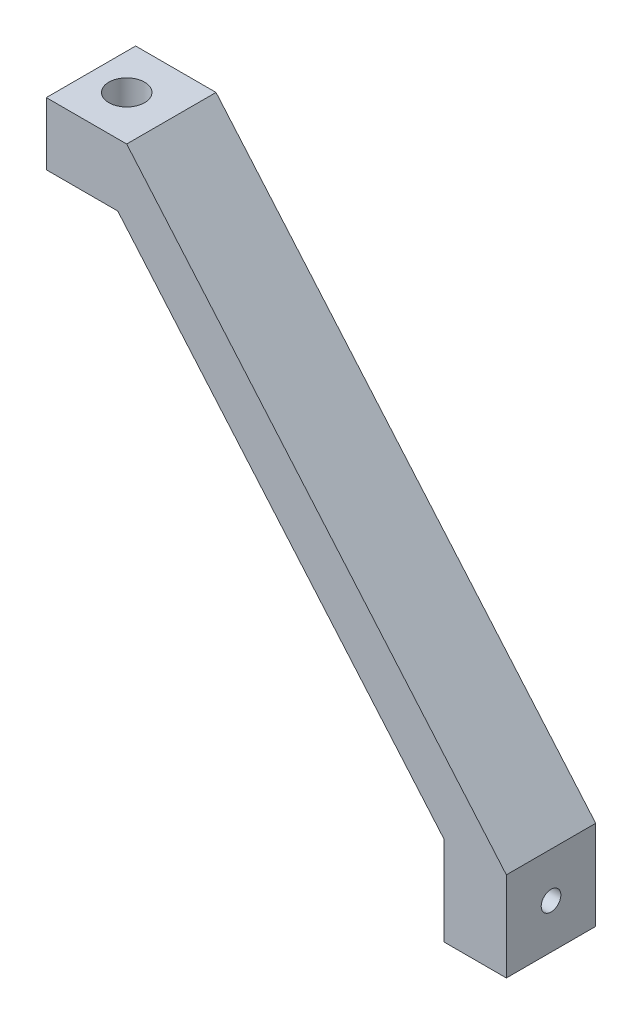
ISO-10303-21;
HEADER;
FILE_DESCRIPTION(('STEP AP214'),'2;1');
FILE_NAME('part.step','',(''),(''),'','','');
FILE_SCHEMA(('AUTOMOTIVE_DESIGN { 1 0 10303 214 1 1 1 1 }'));
ENDSEC;
DATA;
#1=APPLICATION_CONTEXT('core data for automotive mechanical design processes');
#2=APPLICATION_PROTOCOL_DEFINITION('international standard','automotive_design',2000,#1);
#3=PRODUCT_CONTEXT('',#1,'mechanical');
#4=PRODUCT('Part','Part','',(#3));
#5=PRODUCT_RELATED_PRODUCT_CATEGORY('part','',(#4));
#6=PRODUCT_DEFINITION_FORMATION('','',#4);
#7=PRODUCT_DEFINITION_CONTEXT('part definition',#1,'design');
#8=PRODUCT_DEFINITION('design','',#6,#7);
#9=PRODUCT_DEFINITION_SHAPE('','',#8);
#10=(LENGTH_UNIT() NAMED_UNIT(*) SI_UNIT(.MILLI.,.METRE.));
#11=(NAMED_UNIT(*) PLANE_ANGLE_UNIT() SI_UNIT($,.RADIAN.));
#12=(NAMED_UNIT(*) SI_UNIT($,.STERADIAN.) SOLID_ANGLE_UNIT());
#13=UNCERTAINTY_MEASURE_WITH_UNIT(LENGTH_MEASURE(1.E-05),#10,'distance_accuracy_value','');
#14=(GEOMETRIC_REPRESENTATION_CONTEXT(3) GLOBAL_UNCERTAINTY_ASSIGNED_CONTEXT((#13)) GLOBAL_UNIT_ASSIGNED_CONTEXT((#10,
#11,#12)) REPRESENTATION_CONTEXT('',''));
#15=CARTESIAN_POINT('',(0.,0.,0.));
#16=DIRECTION('',(0.,0.,1.));
#17=DIRECTION('',(1.,0.,0.));
#18=AXIS2_PLACEMENT_3D('',#15,#16,#17);
#19=CARTESIAN_POINT('',(0.,0.,10.));
#20=DIRECTION('',(-0.759384877297726,-0.650641689512375,0.));
#21=DIRECTION('',(0.650641689512375,-0.759384877297726,0.));
#22=AXIS2_PLACEMENT_3D('',#19,#20,#21);
#23=PLANE('',#22);
#24=DIRECTION('',(-0.650641689512375,0.759384877297726,0.));
#25=VECTOR('',#24,1.);
#26=CARTESIAN_POINT('',(0.,0.,0.));
#27=LINE('',#26,#25);
#28=CARTESIAN_POINT('',(0.,0.,0.));
#29=VERTEX_POINT('',#28);
#30=CARTESIAN_POINT('',(-36.4997207632834,42.6,0.));
#31=VERTEX_POINT('',#30);
#32=EDGE_CURVE('E141',#29,#31,#27,.T.);
#33=ORIENTED_EDGE('',*,*,#32,.F.);
#34=DIRECTION('',(0.,0.,-1.));
#35=VECTOR('',#34,1.);
#36=CARTESIAN_POINT('',(0.,0.,10.));
#37=LINE('',#36,#35);
#38=CARTESIAN_POINT('',(0.,0.,10.));
#39=VERTEX_POINT('',#38);
#40=EDGE_CURVE('E11',#39,#29,#37,.T.);
#41=ORIENTED_EDGE('',*,*,#40,.F.);
#42=DIRECTION('',(-0.650641689512375,0.759384877297726,0.));
#43=VECTOR('',#42,1.);
#44=CARTESIAN_POINT('',(0.,0.,10.));
#45=LINE('',#44,#43);
#46=CARTESIAN_POINT('',(-36.4997207632834,42.6,10.));
#47=VERTEX_POINT('',#46);
#48=EDGE_CURVE('E167',#39,#47,#45,.T.);
#49=ORIENTED_EDGE('',*,*,#48,.T.);
#50=DIRECTION('',(0.,0.,-1.));
#51=VECTOR('',#50,1.);
#52=CARTESIAN_POINT('',(-36.4997207632834,42.6,10.));
#53=LINE('',#52,#51);
#54=EDGE_CURVE('E58',#47,#31,#53,.T.);
#55=ORIENTED_EDGE('',*,*,#54,.T.);
#56=EDGE_LOOP('',(#33,#41,#49,#55));
#57=FACE_BOUND('',#56,.T.);
#58=ADVANCED_FACE('F40',(#57),#23,.T.);
#59=CARTESIAN_POINT('',(0.,0.,10.));
#60=DIRECTION('',(1.,0.,0.));
#61=DIRECTION('',(0.,0.,-1.));
#62=AXIS2_PLACEMENT_3D('',#59,#60,#61);
#63=PLANE('',#62);
#64=CARTESIAN_POINT('',(0.,-5.,5.));
#65=DIRECTION('',(1.,0.,0.));
#66=DIRECTION('',(0.,0.,-1.));
#67=AXIS2_PLACEMENT_3D('',#64,#65,#66);
#68=CIRCLE('',#67,1.1);
#69=CARTESIAN_POINT('',(0.,-5.,3.9));
#70=VERTEX_POINT('',#69);
#71=EDGE_CURVE('E214',#70,#70,#68,.T.);
#72=ORIENTED_EDGE('',*,*,#71,.T.);
#73=EDGE_LOOP('',(#72));
#74=FACE_BOUND('',#73,.T.);
#75=DIRECTION('',(0.,-1.,0.));
#76=VECTOR('',#75,1.);
#77=CARTESIAN_POINT('',(0.,0.,0.));
#78=LINE('',#77,#76);
#79=CARTESIAN_POINT('',(0.,-10.,0.));
#80=VERTEX_POINT('',#79);
#81=EDGE_CURVE('E144',#29,#80,#78,.T.);
#82=ORIENTED_EDGE('',*,*,#81,.T.);
#83=DIRECTION('',(0.,0.,-1.));
#84=VECTOR('',#83,1.);
#85=CARTESIAN_POINT('',(0.,-10.,10.));
#86=LINE('',#85,#84);
#87=CARTESIAN_POINT('',(0.,-10.,10.));
#88=VERTEX_POINT('',#87);
#89=EDGE_CURVE('E50',#88,#80,#86,.T.);
#90=ORIENTED_EDGE('',*,*,#89,.F.);
#91=DIRECTION('',(0.,-1.,0.));
#92=VECTOR('',#91,1.);
#93=CARTESIAN_POINT('',(0.,0.,10.));
#94=LINE('',#93,#92);
#95=EDGE_CURVE('E203',#39,#88,#94,.T.);
#96=ORIENTED_EDGE('',*,*,#95,.F.);
#97=ORIENTED_EDGE('',*,*,#40,.T.);
#98=EDGE_LOOP('',(#82,#90,#96,#97));
#99=FACE_BOUND('',#98,.T.);
#100=ADVANCED_FACE('F235',(#74,#99),#63,.F.);
#101=CARTESIAN_POINT('',(0.,-10.,10.));
#102=DIRECTION('',(0.,1.,0.));
#103=DIRECTION('',(0.,0.,1.));
#104=AXIS2_PLACEMENT_3D('',#101,#102,#103);
#105=PLANE('',#104);
#106=DIRECTION('',(1.,0.,0.));
#107=VECTOR('',#106,1.);
#108=CARTESIAN_POINT('',(0.,-10.,0.));
#109=LINE('',#108,#107);
#110=CARTESIAN_POINT('',(7.,-10.,0.));
#111=VERTEX_POINT('',#110);
#112=EDGE_CURVE('E147',#80,#111,#109,.T.);
#113=ORIENTED_EDGE('',*,*,#112,.T.);
#114=DIRECTION('',(0.,0.,-1.));
#115=VECTOR('',#114,1.);
#116=CARTESIAN_POINT('',(7.,-10.,10.));
#117=LINE('',#116,#115);
#118=CARTESIAN_POINT('',(7.,-10.,10.));
#119=VERTEX_POINT('',#118);
#120=EDGE_CURVE('E177',#119,#111,#117,.T.);
#121=ORIENTED_EDGE('',*,*,#120,.F.);
#122=DIRECTION('',(1.,0.,0.));
#123=VECTOR('',#122,1.);
#124=CARTESIAN_POINT('',(0.,-10.,10.));
#125=LINE('',#124,#123);
#126=EDGE_CURVE('E188',#88,#119,#125,.T.);
#127=ORIENTED_EDGE('',*,*,#126,.F.);
#128=ORIENTED_EDGE('',*,*,#89,.T.);
#129=EDGE_LOOP('',(#113,#121,#127,#128));
#130=FACE_BOUND('',#129,.T.);
#131=ADVANCED_FACE('F186',(#130),#105,.F.);
#132=CARTESIAN_POINT('',(7.,0.,10.));
#133=DIRECTION('',(1.,0.,0.));
#134=DIRECTION('',(0.,0.,-1.));
#135=AXIS2_PLACEMENT_3D('',#132,#133,#134);
#136=PLANE('',#135);
#137=CARTESIAN_POINT('',(7.,-5.,5.));
#138=DIRECTION('',(1.,0.,0.));
#139=DIRECTION('',(0.,0.,-1.));
#140=AXIS2_PLACEMENT_3D('',#137,#138,#139);
#141=CIRCLE('',#140,1.1);
#142=CARTESIAN_POINT('',(7.,-5.,3.9));
#143=VERTEX_POINT('',#142);
#144=EDGE_CURVE('E218',#143,#143,#141,.T.);
#145=ORIENTED_EDGE('',*,*,#144,.F.);
#146=EDGE_LOOP('',(#145));
#147=FACE_BOUND('',#146,.T.);
#148=DIRECTION('',(0.,-1.,0.));
#149=VECTOR('',#148,1.);
#150=CARTESIAN_POINT('',(7.,0.,0.));
#151=LINE('',#150,#149);
#152=CARTESIAN_POINT('',(7.,0.,0.));
#153=VERTEX_POINT('',#152);
#154=EDGE_CURVE('E151',#153,#111,#151,.T.);
#155=ORIENTED_EDGE('',*,*,#154,.F.);
#156=DIRECTION('',(0.,0.,-1.));
#157=VECTOR('',#156,1.);
#158=CARTESIAN_POINT('',(7.,0.,10.));
#159=LINE('',#158,#157);
#160=CARTESIAN_POINT('',(7.,0.,10.));
#161=VERTEX_POINT('',#160);
#162=EDGE_CURVE('E174',#161,#153,#159,.T.);
#163=ORIENTED_EDGE('',*,*,#162,.F.);
#164=DIRECTION('',(0.,-1.,0.));
#165=VECTOR('',#164,1.);
#166=CARTESIAN_POINT('',(7.,0.,10.));
#167=LINE('',#166,#165);
#168=EDGE_CURVE('E198',#161,#119,#167,.T.);
#169=ORIENTED_EDGE('',*,*,#168,.T.);
#170=ORIENTED_EDGE('',*,*,#120,.T.);
#171=EDGE_LOOP('',(#155,#163,#169,#170));
#172=FACE_BOUND('',#171,.T.);
#173=ADVANCED_FACE('F196',(#147,#172),#136,.T.);
#174=CARTESIAN_POINT('',(4.03644281726323,3.45864555914692,10.));
#175=DIRECTION('',(-0.759364660871482,-0.650665284012862,0.));
#176=DIRECTION('',(0.650665284012862,-0.759364660871482,0.));
#177=AXIS2_PLACEMENT_3D('',#174,#175,#176);
#178=PLANE('',#177);
#179=DIRECTION('',(-0.650665284012862,0.759364660871482,0.));
#180=VECTOR('',#179,1.);
#181=CARTESIAN_POINT('',(4.03644281726323,3.45864555914692,0.));
#182=LINE('',#181,#180);
#183=CARTESIAN_POINT('',(-35.5,49.6,0.));
#184=VERTEX_POINT('',#183);
#185=EDGE_CURVE('E155',#153,#184,#182,.T.);
#186=ORIENTED_EDGE('',*,*,#185,.T.);
#187=DIRECTION('',(0.,0.,-1.));
#188=VECTOR('',#187,1.);
#189=CARTESIAN_POINT('',(-35.5,49.6,10.));
#190=LINE('',#189,#188);
#191=CARTESIAN_POINT('',(-35.5,49.6,10.));
#192=VERTEX_POINT('',#191);
#193=EDGE_CURVE('E131',#192,#184,#190,.T.);
#194=ORIENTED_EDGE('',*,*,#193,.F.);
#195=DIRECTION('',(-0.650665284012862,0.759364660871482,0.));
#196=VECTOR('',#195,1.);
#197=CARTESIAN_POINT('',(4.03644281726323,3.45864555914692,10.));
#198=LINE('',#197,#196);
#199=EDGE_CURVE('E117',#161,#192,#198,.T.);
#200=ORIENTED_EDGE('',*,*,#199,.F.);
#201=ORIENTED_EDGE('',*,*,#162,.T.);
#202=EDGE_LOOP('',(#186,#194,#200,#201));
#203=FACE_BOUND('',#202,.T.);
#204=ADVANCED_FACE('F227',(#203),#178,.F.);
#205=CARTESIAN_POINT('',(0.,49.6,10.));
#206=DIRECTION('',(0.,-1.,0.));
#207=DIRECTION('',(0.,0.,-1.));
#208=AXIS2_PLACEMENT_3D('',#205,#206,#207);
#209=PLANE('',#208);
#210=CARTESIAN_POINT('',(-40.5,49.6,5.));
#211=DIRECTION('',(0.,1.,0.));
#212=DIRECTION('',(0.,0.,1.));
#213=AXIS2_PLACEMENT_3D('',#210,#211,#212);
#214=CIRCLE('',#213,2.);
#215=CARTESIAN_POINT('',(-40.5,49.6,7.));
#216=VERTEX_POINT('',#215);
#217=EDGE_CURVE('E210',#216,#216,#214,.T.);
#218=ORIENTED_EDGE('',*,*,#217,.F.);
#219=EDGE_LOOP('',(#218));
#220=FACE_BOUND('',#219,.T.);
#221=DIRECTION('',(-1.,0.,0.));
#222=VECTOR('',#221,1.);
#223=CARTESIAN_POINT('',(0.,49.6,0.));
#224=LINE('',#223,#222);
#225=CARTESIAN_POINT('',(-44.5,49.6,0.));
#226=VERTEX_POINT('',#225);
#227=EDGE_CURVE('E127',#184,#226,#224,.T.);
#228=ORIENTED_EDGE('',*,*,#227,.T.);
#229=DIRECTION('',(0.,0.,-1.));
#230=VECTOR('',#229,1.);
#231=CARTESIAN_POINT('',(-44.5,49.6,10.));
#232=LINE('',#231,#230);
#233=CARTESIAN_POINT('',(-44.5,49.6,10.));
#234=VERTEX_POINT('',#233);
#235=EDGE_CURVE('E124',#234,#226,#232,.T.);
#236=ORIENTED_EDGE('',*,*,#235,.F.);
#237=DIRECTION('',(-1.,0.,0.));
#238=VECTOR('',#237,1.);
#239=CARTESIAN_POINT('',(0.,49.6,10.));
#240=LINE('',#239,#238);
#241=EDGE_CURVE('E108',#192,#234,#240,.T.);
#242=ORIENTED_EDGE('',*,*,#241,.F.);
#243=ORIENTED_EDGE('',*,*,#193,.T.);
#244=EDGE_LOOP('',(#228,#236,#242,#243));
#245=FACE_BOUND('',#244,.T.);
#246=ADVANCED_FACE('F125',(#220,#245),#209,.F.);
#247=CARTESIAN_POINT('',(-44.5,0.,10.));
#248=DIRECTION('',(1.,0.,0.));
#249=DIRECTION('',(0.,0.,-1.));
#250=AXIS2_PLACEMENT_3D('',#247,#248,#249);
#251=PLANE('',#250);
#252=DIRECTION('',(0.,-1.,0.));
#253=VECTOR('',#252,1.);
#254=CARTESIAN_POINT('',(-44.5,0.,0.));
#255=LINE('',#254,#253);
#256=CARTESIAN_POINT('',(-44.5,42.6,0.));
#257=VERTEX_POINT('',#256);
#258=EDGE_CURVE('E160',#226,#257,#255,.T.);
#259=ORIENTED_EDGE('',*,*,#258,.T.);
#260=DIRECTION('',(0.,0.,-1.));
#261=VECTOR('',#260,1.);
#262=CARTESIAN_POINT('',(-44.5,42.6,10.));
#263=LINE('',#262,#261);
#264=CARTESIAN_POINT('',(-44.5,42.6,10.));
#265=VERTEX_POINT('',#264);
#266=EDGE_CURVE('E84',#265,#257,#263,.T.);
#267=ORIENTED_EDGE('',*,*,#266,.F.);
#268=DIRECTION('',(0.,-1.,0.));
#269=VECTOR('',#268,1.);
#270=CARTESIAN_POINT('',(-44.5,0.,10.));
#271=LINE('',#270,#269);
#272=EDGE_CURVE('E114',#234,#265,#271,.T.);
#273=ORIENTED_EDGE('',*,*,#272,.F.);
#274=ORIENTED_EDGE('',*,*,#235,.T.);
#275=EDGE_LOOP('',(#259,#267,#273,#274));
#276=FACE_BOUND('',#275,.T.);
#277=ADVANCED_FACE('F133',(#276),#251,.F.);
#278=CARTESIAN_POINT('',(0.,42.6,10.));
#279=DIRECTION('',(0.,-1.,0.));
#280=DIRECTION('',(0.,0.,-1.));
#281=AXIS2_PLACEMENT_3D('',#278,#279,#280);
#282=PLANE('',#281);
#283=CARTESIAN_POINT('',(-40.5,42.6,5.));
#284=DIRECTION('',(0.,-1.,0.));
#285=DIRECTION('',(0.,0.,-1.));
#286=AXIS2_PLACEMENT_3D('',#283,#284,#285);
#287=CIRCLE('',#286,2.);
#288=CARTESIAN_POINT('',(-40.5,42.6,3.));
#289=VERTEX_POINT('',#288);
#290=EDGE_CURVE('E43',#289,#289,#287,.T.);
#291=ORIENTED_EDGE('',*,*,#290,.F.);
#292=EDGE_LOOP('',(#291));
#293=FACE_BOUND('',#292,.T.);
#294=DIRECTION('',(-1.,0.,0.));
#295=VECTOR('',#294,1.);
#296=CARTESIAN_POINT('',(0.,42.6,0.));
#297=LINE('',#296,#295);
#298=EDGE_CURVE('E163',#31,#257,#297,.T.);
#299=ORIENTED_EDGE('',*,*,#298,.F.);
#300=ORIENTED_EDGE('',*,*,#54,.F.);
#301=DIRECTION('',(-1.,0.,0.));
#302=VECTOR('',#301,1.);
#303=CARTESIAN_POINT('',(0.,42.6,10.));
#304=LINE('',#303,#302);
#305=EDGE_CURVE('E135',#47,#265,#304,.T.);
#306=ORIENTED_EDGE('',*,*,#305,.T.);
#307=ORIENTED_EDGE('',*,*,#266,.T.);
#308=EDGE_LOOP('',(#299,#300,#306,#307));
#309=FACE_BOUND('',#308,.T.);
#310=ADVANCED_FACE('F242',(#293,#309),#282,.T.);
#311=CARTESIAN_POINT('',(0.,0.,10.));
#312=DIRECTION('',(0.,0.,1.));
#313=DIRECTION('',(1.,0.,0.));
#314=AXIS2_PLACEMENT_3D('',#311,#312,#313);
#315=PLANE('',#314);
#316=ORIENTED_EDGE('',*,*,#48,.F.);
#317=ORIENTED_EDGE('',*,*,#95,.T.);
#318=ORIENTED_EDGE('',*,*,#126,.T.);
#319=ORIENTED_EDGE('',*,*,#168,.F.);
#320=ORIENTED_EDGE('',*,*,#199,.T.);
#321=ORIENTED_EDGE('',*,*,#241,.T.);
#322=ORIENTED_EDGE('',*,*,#272,.T.);
#323=ORIENTED_EDGE('',*,*,#305,.F.);
#324=EDGE_LOOP('',(#316,#317,#318,#319,#320,#321,#322,#323));
#325=FACE_BOUND('',#324,.T.);
#326=ADVANCED_FACE('F111',(#325),#315,.T.);
#327=CARTESIAN_POINT('',(0.,0.,0.));
#328=DIRECTION('',(0.,0.,1.));
#329=DIRECTION('',(1.,0.,0.));
#330=AXIS2_PLACEMENT_3D('',#327,#328,#329);
#331=PLANE('',#330);
#332=ORIENTED_EDGE('',*,*,#32,.T.);
#333=ORIENTED_EDGE('',*,*,#298,.T.);
#334=ORIENTED_EDGE('',*,*,#258,.F.);
#335=ORIENTED_EDGE('',*,*,#227,.F.);
#336=ORIENTED_EDGE('',*,*,#185,.F.);
#337=ORIENTED_EDGE('',*,*,#154,.T.);
#338=ORIENTED_EDGE('',*,*,#112,.F.);
#339=ORIENTED_EDGE('',*,*,#81,.F.);
#340=EDGE_LOOP('',(#332,#333,#334,#335,#336,#337,#338,#339));
#341=FACE_BOUND('',#340,.T.);
#342=ADVANCED_FACE('F192',(#341),#331,.F.);
#343=CARTESIAN_POINT('',(-40.5,39.6,5.));
#344=DIRECTION('',(0.,1.,0.));
#345=DIRECTION('',(0.,0.,1.));
#346=AXIS2_PLACEMENT_3D('',#343,#344,#345);
#347=CYLINDRICAL_SURFACE('',#346,2.);
#348=ORIENTED_EDGE('',*,*,#290,.T.);
#349=EDGE_LOOP('',(#348));
#350=FACE_BOUND('',#349,.T.);
#351=ORIENTED_EDGE('',*,*,#217,.T.);
#352=EDGE_LOOP('',(#351));
#353=FACE_BOUND('',#352,.T.);
#354=ADVANCED_FACE('F261',(#350,#353),#347,.F.);
#355=CARTESIAN_POINT('',(-3.,-5.,5.));
#356=DIRECTION('',(1.,0.,0.));
#357=DIRECTION('',(0.,0.,-1.));
#358=AXIS2_PLACEMENT_3D('',#355,#356,#357);
#359=CYLINDRICAL_SURFACE('',#358,1.1);
#360=ORIENTED_EDGE('',*,*,#144,.T.);
#361=EDGE_LOOP('',(#360));
#362=FACE_BOUND('',#361,.T.);
#363=ORIENTED_EDGE('',*,*,#71,.F.);
#364=EDGE_LOOP('',(#363));
#365=FACE_BOUND('',#364,.T.);
#366=ADVANCED_FACE('F223',(#362,#365),#359,.F.);
#367=CLOSED_SHELL('',(#58,#100,#131,#173,#204,#246,#277,#310,#326,#342,#354,#366));
#368=MANIFOLD_SOLID_BREP('B2',#367);
#369=ADVANCED_BREP_SHAPE_REPRESENTATION('',(#18,#368),#14);
#370=SHAPE_DEFINITION_REPRESENTATION(#9,#369);
ENDSEC;
END-ISO-10303-21;
